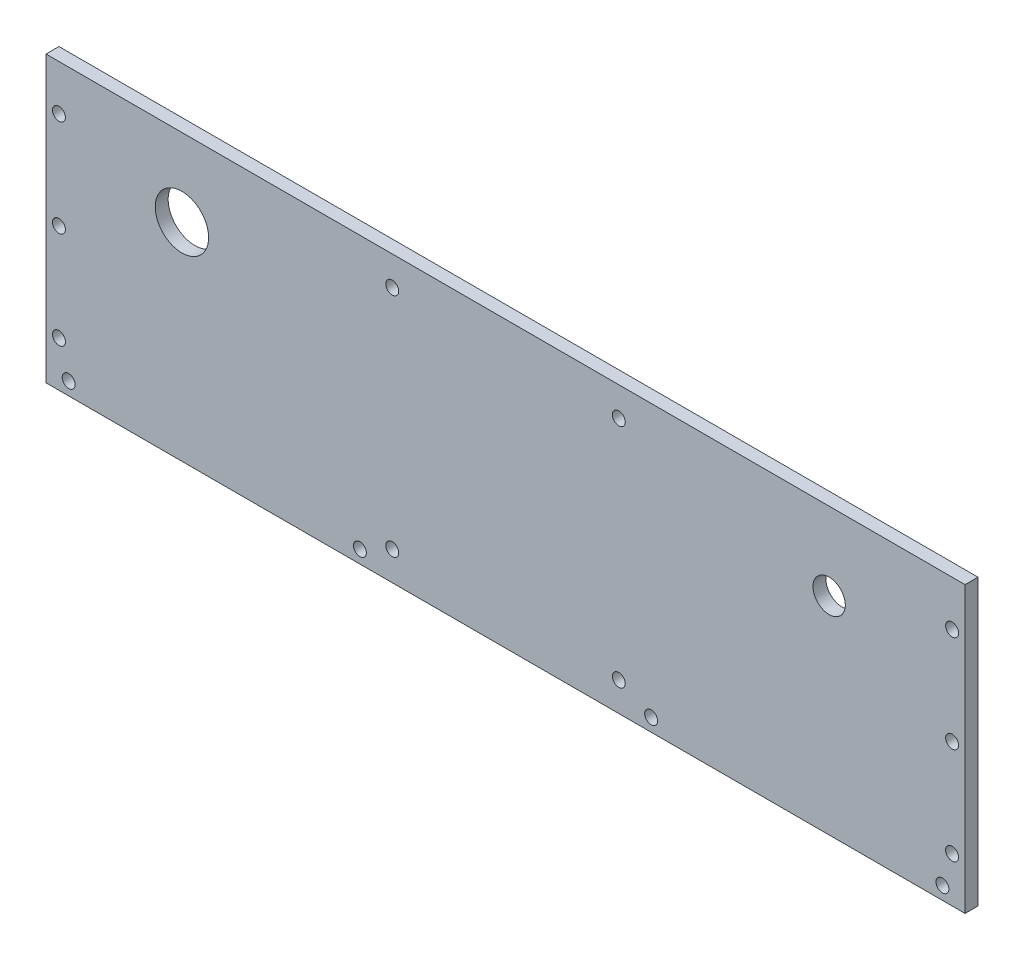
ISO-10303-21;
HEADER;
FILE_DESCRIPTION(('STEP AP214'),'2;1');
FILE_NAME('part.step','',(''),(''),'','','');
FILE_SCHEMA(('AUTOMOTIVE_DESIGN { 1 0 10303 214 1 1 1 1 }'));
ENDSEC;
DATA;
#1=APPLICATION_CONTEXT('core data for automotive mechanical design processes');
#2=APPLICATION_PROTOCOL_DEFINITION('international standard','automotive_design',2000,#1);
#3=PRODUCT_CONTEXT('',#1,'mechanical');
#4=PRODUCT('Part','Part','',(#3));
#5=PRODUCT_RELATED_PRODUCT_CATEGORY('part','',(#4));
#6=PRODUCT_DEFINITION_FORMATION('','',#4);
#7=PRODUCT_DEFINITION_CONTEXT('part definition',#1,'design');
#8=PRODUCT_DEFINITION('design','',#6,#7);
#9=PRODUCT_DEFINITION_SHAPE('','',#8);
#10=(LENGTH_UNIT() NAMED_UNIT(*) SI_UNIT(.MILLI.,.METRE.));
#11=(NAMED_UNIT(*) PLANE_ANGLE_UNIT() SI_UNIT($,.RADIAN.));
#12=(NAMED_UNIT(*) SI_UNIT($,.STERADIAN.) SOLID_ANGLE_UNIT());
#13=UNCERTAINTY_MEASURE_WITH_UNIT(LENGTH_MEASURE(1.E-05),#10,'distance_accuracy_value','');
#14=(GEOMETRIC_REPRESENTATION_CONTEXT(3) GLOBAL_UNCERTAINTY_ASSIGNED_CONTEXT((#13)) GLOBAL_UNIT_ASSIGNED_CONTEXT((#10,
#11,#12)) REPRESENTATION_CONTEXT('',''));
#15=CARTESIAN_POINT('',(0.,0.,0.));
#16=DIRECTION('',(0.,0.,1.));
#17=DIRECTION('',(1.,0.,0.));
#18=AXIS2_PLACEMENT_3D('',#15,#16,#17);
#19=CARTESIAN_POINT('',(0.,0.,4.));
#20=DIRECTION('',(1.,0.,0.));
#21=DIRECTION('',(0.,0.,-1.));
#22=AXIS2_PLACEMENT_3D('',#19,#20,#21);
#23=PLANE('',#22);
#24=DIRECTION('',(0.,-1.,0.));
#25=VECTOR('',#24,1.);
#26=CARTESIAN_POINT('',(0.,0.,0.));
#27=LINE('',#26,#25);
#28=CARTESIAN_POINT('',(0.,88.,0.));
#29=VERTEX_POINT('',#28);
#30=CARTESIAN_POINT('',(0.,0.,0.));
#31=VERTEX_POINT('',#30);
#32=EDGE_CURVE('E96',#29,#31,#27,.T.);
#33=ORIENTED_EDGE('',*,*,#32,.T.);
#34=DIRECTION('',(0.,0.,-1.));
#35=VECTOR('',#34,1.);
#36=CARTESIAN_POINT('',(0.,0.,4.));
#37=LINE('',#36,#35);
#38=CARTESIAN_POINT('',(0.,0.,4.));
#39=VERTEX_POINT('',#38);
#40=EDGE_CURVE('E11',#39,#31,#37,.T.);
#41=ORIENTED_EDGE('',*,*,#40,.F.);
#42=DIRECTION('',(0.,-1.,0.));
#43=VECTOR('',#42,1.);
#44=CARTESIAN_POINT('',(0.,0.,4.));
#45=LINE('',#44,#43);
#46=CARTESIAN_POINT('',(0.,88.,4.));
#47=VERTEX_POINT('',#46);
#48=EDGE_CURVE('E84',#47,#39,#45,.T.);
#49=ORIENTED_EDGE('',*,*,#48,.F.);
#50=DIRECTION('',(0.,0.,-1.));
#51=VECTOR('',#50,1.);
#52=CARTESIAN_POINT('',(0.,88.,4.));
#53=LINE('',#52,#51);
#54=EDGE_CURVE('E92',#47,#29,#53,.T.);
#55=ORIENTED_EDGE('',*,*,#54,.T.);
#56=EDGE_LOOP('',(#33,#41,#49,#55));
#57=FACE_BOUND('',#56,.T.);
#58=ADVANCED_FACE('F33',(#57),#23,.F.);
#59=CARTESIAN_POINT('',(0.,0.,4.));
#60=DIRECTION('',(0.,1.,0.));
#61=DIRECTION('',(0.,0.,1.));
#62=AXIS2_PLACEMENT_3D('',#59,#60,#61);
#63=PLANE('',#62);
#64=DIRECTION('',(1.,0.,0.));
#65=VECTOR('',#64,1.);
#66=CARTESIAN_POINT('',(0.,0.,0.));
#67=LINE('',#66,#65);
#68=CARTESIAN_POINT('',(284.,0.,0.));
#69=VERTEX_POINT('',#68);
#70=EDGE_CURVE('E88',#31,#69,#67,.T.);
#71=ORIENTED_EDGE('',*,*,#70,.T.);
#72=DIRECTION('',(0.,0.,-1.));
#73=VECTOR('',#72,1.);
#74=CARTESIAN_POINT('',(284.,0.,4.));
#75=LINE('',#74,#73);
#76=CARTESIAN_POINT('',(284.,0.,4.));
#77=VERTEX_POINT('',#76);
#78=EDGE_CURVE('E41',#77,#69,#75,.T.);
#79=ORIENTED_EDGE('',*,*,#78,.F.);
#80=DIRECTION('',(1.,0.,0.));
#81=VECTOR('',#80,1.);
#82=CARTESIAN_POINT('',(0.,0.,4.));
#83=LINE('',#82,#81);
#84=EDGE_CURVE('E79',#39,#77,#83,.T.);
#85=ORIENTED_EDGE('',*,*,#84,.F.);
#86=ORIENTED_EDGE('',*,*,#40,.T.);
#87=EDGE_LOOP('',(#71,#79,#85,#86));
#88=FACE_BOUND('',#87,.T.);
#89=ADVANCED_FACE('F87',(#88),#63,.F.);
#90=CARTESIAN_POINT('',(284.,0.,4.));
#91=DIRECTION('',(-1.,0.,0.));
#92=DIRECTION('',(0.,0.,1.));
#93=AXIS2_PLACEMENT_3D('',#90,#91,#92);
#94=PLANE('',#93);
#95=DIRECTION('',(0.,1.,0.));
#96=VECTOR('',#95,1.);
#97=CARTESIAN_POINT('',(284.,0.,0.));
#98=LINE('',#97,#96);
#99=CARTESIAN_POINT('',(284.,88.,0.));
#100=VERTEX_POINT('',#99);
#101=EDGE_CURVE('E66',#69,#100,#98,.T.);
#102=ORIENTED_EDGE('',*,*,#101,.T.);
#103=DIRECTION('',(0.,0.,-1.));
#104=VECTOR('',#103,1.);
#105=CARTESIAN_POINT('',(284.,88.,4.));
#106=LINE('',#105,#104);
#107=CARTESIAN_POINT('',(284.,88.,4.));
#108=VERTEX_POINT('',#107);
#109=EDGE_CURVE('E89',#108,#100,#106,.T.);
#110=ORIENTED_EDGE('',*,*,#109,.F.);
#111=DIRECTION('',(0.,1.,0.));
#112=VECTOR('',#111,1.);
#113=CARTESIAN_POINT('',(284.,0.,4.));
#114=LINE('',#113,#112);
#115=EDGE_CURVE('E82',#77,#108,#114,.T.);
#116=ORIENTED_EDGE('',*,*,#115,.F.);
#117=ORIENTED_EDGE('',*,*,#78,.T.);
#118=EDGE_LOOP('',(#102,#110,#116,#117));
#119=FACE_BOUND('',#118,.T.);
#120=ADVANCED_FACE('F90',(#119),#94,.F.);
#121=CARTESIAN_POINT('',(0.,88.,4.));
#122=DIRECTION('',(0.,-1.,0.));
#123=DIRECTION('',(0.,0.,-1.));
#124=AXIS2_PLACEMENT_3D('',#121,#122,#123);
#125=PLANE('',#124);
#126=DIRECTION('',(-1.,0.,0.));
#127=VECTOR('',#126,1.);
#128=CARTESIAN_POINT('',(0.,88.,0.));
#129=LINE('',#128,#127);
#130=EDGE_CURVE('E72',#100,#29,#129,.T.);
#131=ORIENTED_EDGE('',*,*,#130,.T.);
#132=ORIENTED_EDGE('',*,*,#54,.F.);
#133=DIRECTION('',(-1.,0.,0.));
#134=VECTOR('',#133,1.);
#135=CARTESIAN_POINT('',(0.,88.,4.));
#136=LINE('',#135,#134);
#137=EDGE_CURVE('E49',#108,#47,#136,.T.);
#138=ORIENTED_EDGE('',*,*,#137,.F.);
#139=ORIENTED_EDGE('',*,*,#109,.T.);
#140=EDGE_LOOP('',(#131,#132,#138,#139));
#141=FACE_BOUND('',#140,.T.);
#142=ADVANCED_FACE('F104',(#141),#125,.F.);
#143=CARTESIAN_POINT('',(0.,0.,4.));
#144=DIRECTION('',(0.,0.,-1.));
#145=DIRECTION('',(-1.,0.,0.));
#146=AXIS2_PLACEMENT_3D('',#143,#144,#145);
#147=PLANE('',#146);
#148=CARTESIAN_POINT('',(280.,44.,4.));
#149=DIRECTION('',(0.,0.,1.));
#150=DIRECTION('',(-1.,0.,0.));
#151=AXIS2_PLACEMENT_3D('',#148,#149,#150);
#152=CIRCLE('',#151,2.);
#153=CARTESIAN_POINT('',(278.,44.,4.));
#154=VERTEX_POINT('',#153);
#155=EDGE_CURVE('E177',#154,#154,#152,.T.);
#156=ORIENTED_EDGE('',*,*,#155,.F.);
#157=EDGE_LOOP('',(#156));
#158=FACE_BOUND('',#157,.T.);
#159=CARTESIAN_POINT('',(280.,74.,4.));
#160=DIRECTION('',(0.,0.,1.));
#161=DIRECTION('',(1.,0.,0.));
#162=AXIS2_PLACEMENT_3D('',#159,#160,#161);
#163=CIRCLE('',#162,2.);
#164=CARTESIAN_POINT('',(282.,74.,4.));
#165=VERTEX_POINT('',#164);
#166=EDGE_CURVE('E171',#165,#165,#163,.T.);
#167=ORIENTED_EDGE('',*,*,#166,.F.);
#168=EDGE_LOOP('',(#167));
#169=FACE_BOUND('',#168,.T.);
#170=CARTESIAN_POINT('',(280.,14.,4.));
#171=DIRECTION('',(0.,0.,1.));
#172=DIRECTION('',(-1.,0.,0.));
#173=AXIS2_PLACEMENT_3D('',#170,#171,#172);
#174=CIRCLE('',#173,2.);
#175=CARTESIAN_POINT('',(278.,14.,4.));
#176=VERTEX_POINT('',#175);
#177=EDGE_CURVE('E165',#176,#176,#174,.T.);
#178=ORIENTED_EDGE('',*,*,#177,.F.);
#179=EDGE_LOOP('',(#178));
#180=FACE_BOUND('',#179,.T.);
#181=CARTESIAN_POINT('',(6.99999999999999,4.00000000000002,4.));
#182=DIRECTION('',(0.,0.,1.));
#183=DIRECTION('',(1.,0.,0.));
#184=AXIS2_PLACEMENT_3D('',#181,#182,#183);
#185=CIRCLE('',#184,2.);
#186=CARTESIAN_POINT('',(9.,4.00000000000002,4.));
#187=VERTEX_POINT('',#186);
#188=EDGE_CURVE('E158',#187,#187,#185,.T.);
#189=ORIENTED_EDGE('',*,*,#188,.F.);
#190=EDGE_LOOP('',(#189));
#191=FACE_BOUND('',#190,.T.);
#192=CARTESIAN_POINT('',(97.,4.00000000000003,4.));
#193=DIRECTION('',(0.,0.,1.));
#194=DIRECTION('',(1.,0.,0.));
#195=AXIS2_PLACEMENT_3D('',#192,#193,#194);
#196=CIRCLE('',#195,2.);
#197=CARTESIAN_POINT('',(99.,4.00000000000003,4.));
#198=VERTEX_POINT('',#197);
#199=EDGE_CURVE('E200',#198,#198,#196,.T.);
#200=ORIENTED_EDGE('',*,*,#199,.F.);
#201=EDGE_LOOP('',(#200));
#202=FACE_BOUND('',#201,.T.);
#203=CARTESIAN_POINT('',(187.,4.00000000000003,4.));
#204=DIRECTION('',(0.,0.,1.));
#205=DIRECTION('',(-1.,0.,0.));
#206=AXIS2_PLACEMENT_3D('',#203,#204,#205);
#207=CIRCLE('',#206,2.);
#208=CARTESIAN_POINT('',(185.,4.00000000000003,4.));
#209=VERTEX_POINT('',#208);
#210=EDGE_CURVE('E194',#209,#209,#207,.T.);
#211=ORIENTED_EDGE('',*,*,#210,.F.);
#212=EDGE_LOOP('',(#211));
#213=FACE_BOUND('',#212,.T.);
#214=CARTESIAN_POINT('',(277.,4.00000000000002,4.));
#215=DIRECTION('',(0.,0.,1.));
#216=DIRECTION('',(-1.,0.,0.));
#217=AXIS2_PLACEMENT_3D('',#214,#215,#216);
#218=CIRCLE('',#217,2.);
#219=CARTESIAN_POINT('',(275.,4.00000000000002,4.));
#220=VERTEX_POINT('',#219);
#221=EDGE_CURVE('E188',#220,#220,#218,.T.);
#222=ORIENTED_EDGE('',*,*,#221,.F.);
#223=EDGE_LOOP('',(#222));
#224=FACE_BOUND('',#223,.T.);
#225=CARTESIAN_POINT('',(242.,64.,4.));
#226=DIRECTION('',(0.,0.,1.));
#227=DIRECTION('',(1.,0.,0.));
#228=AXIS2_PLACEMENT_3D('',#225,#226,#227);
#229=CIRCLE('',#228,4.99999999999999);
#230=CARTESIAN_POINT('',(247.,64.,4.));
#231=VERTEX_POINT('',#230);
#232=EDGE_CURVE('E182',#231,#231,#229,.T.);
#233=ORIENTED_EDGE('',*,*,#232,.F.);
#234=EDGE_LOOP('',(#233));
#235=FACE_BOUND('',#234,.T.);
#236=CARTESIAN_POINT('',(42.,64.,4.));
#237=DIRECTION('',(0.,0.,1.));
#238=DIRECTION('',(1.,0.,0.));
#239=AXIS2_PLACEMENT_3D('',#236,#237,#238);
#240=CIRCLE('',#239,8.25);
#241=CARTESIAN_POINT('',(50.25,64.,4.));
#242=VERTEX_POINT('',#241);
#243=EDGE_CURVE('E123',#242,#242,#240,.T.);
#244=ORIENTED_EDGE('',*,*,#243,.F.);
#245=EDGE_LOOP('',(#244));
#246=FACE_BOUND('',#245,.T.);
#247=CARTESIAN_POINT('',(4.,14.,4.));
#248=DIRECTION('',(0.,0.,1.));
#249=DIRECTION('',(1.,0.,0.));
#250=AXIS2_PLACEMENT_3D('',#247,#248,#249);
#251=CIRCLE('',#250,2.);
#252=CARTESIAN_POINT('',(6.,14.,4.));
#253=VERTEX_POINT('',#252);
#254=EDGE_CURVE('E116',#253,#253,#251,.T.);
#255=ORIENTED_EDGE('',*,*,#254,.F.);
#256=EDGE_LOOP('',(#255));
#257=FACE_BOUND('',#256,.T.);
#258=CARTESIAN_POINT('',(4.,74.,4.));
#259=DIRECTION('',(0.,0.,1.));
#260=DIRECTION('',(-1.,0.,0.));
#261=AXIS2_PLACEMENT_3D('',#258,#259,#260);
#262=CIRCLE('',#261,2.);
#263=CARTESIAN_POINT('',(1.99999999999999,74.,4.));
#264=VERTEX_POINT('',#263);
#265=EDGE_CURVE('E137',#264,#264,#262,.T.);
#266=ORIENTED_EDGE('',*,*,#265,.F.);
#267=EDGE_LOOP('',(#266));
#268=FACE_BOUND('',#267,.T.);
#269=CARTESIAN_POINT('',(4.00000000000001,44.,4.));
#270=DIRECTION('',(0.,0.,1.));
#271=DIRECTION('',(1.,0.,0.));
#272=AXIS2_PLACEMENT_3D('',#269,#270,#271);
#273=CIRCLE('',#272,2.);
#274=CARTESIAN_POINT('',(6.00000000000001,44.,4.));
#275=VERTEX_POINT('',#274);
#276=EDGE_CURVE('E130',#275,#275,#273,.T.);
#277=ORIENTED_EDGE('',*,*,#276,.F.);
#278=EDGE_LOOP('',(#277));
#279=FACE_BOUND('',#278,.T.);
#280=CARTESIAN_POINT('',(177.,79.,4.));
#281=DIRECTION('',(0.,0.,1.));
#282=DIRECTION('',(-1.,0.,0.));
#283=AXIS2_PLACEMENT_3D('',#280,#281,#282);
#284=CIRCLE('',#283,2.);
#285=CARTESIAN_POINT('',(175.,79.,4.));
#286=VERTEX_POINT('',#285);
#287=EDGE_CURVE('E129',#286,#286,#284,.T.);
#288=ORIENTED_EDGE('',*,*,#287,.F.);
#289=EDGE_LOOP('',(#288));
#290=FACE_BOUND('',#289,.T.);
#291=CARTESIAN_POINT('',(177.,9.00000000000001,4.));
#292=DIRECTION('',(0.,0.,1.));
#293=DIRECTION('',(1.,0.,0.));
#294=AXIS2_PLACEMENT_3D('',#291,#292,#293);
#295=CIRCLE('',#294,2.);
#296=CARTESIAN_POINT('',(179.,9.00000000000001,4.));
#297=VERTEX_POINT('',#296);
#298=EDGE_CURVE('E147',#297,#297,#295,.T.);
#299=ORIENTED_EDGE('',*,*,#298,.F.);
#300=EDGE_LOOP('',(#299));
#301=FACE_BOUND('',#300,.T.);
#302=CARTESIAN_POINT('',(107.,9.00000000000001,4.));
#303=DIRECTION('',(0.,0.,1.));
#304=DIRECTION('',(-1.,0.,0.));
#305=AXIS2_PLACEMENT_3D('',#302,#303,#304);
#306=CIRCLE('',#305,2.);
#307=CARTESIAN_POINT('',(105.,9.00000000000001,4.));
#308=VERTEX_POINT('',#307);
#309=EDGE_CURVE('E153',#308,#308,#306,.T.);
#310=ORIENTED_EDGE('',*,*,#309,.F.);
#311=EDGE_LOOP('',(#310));
#312=FACE_BOUND('',#311,.T.);
#313=CARTESIAN_POINT('',(107.,79.,4.));
#314=DIRECTION('',(0.,0.,1.));
#315=DIRECTION('',(1.,0.,0.));
#316=AXIS2_PLACEMENT_3D('',#313,#314,#315);
#317=CIRCLE('',#316,2.);
#318=CARTESIAN_POINT('',(109.,79.,4.));
#319=VERTEX_POINT('',#318);
#320=EDGE_CURVE('E110',#319,#319,#317,.T.);
#321=ORIENTED_EDGE('',*,*,#320,.F.);
#322=EDGE_LOOP('',(#321));
#323=FACE_BOUND('',#322,.T.);
#324=ORIENTED_EDGE('',*,*,#48,.T.);
#325=ORIENTED_EDGE('',*,*,#84,.T.);
#326=ORIENTED_EDGE('',*,*,#115,.T.);
#327=ORIENTED_EDGE('',*,*,#137,.T.);
#328=EDGE_LOOP('',(#324,#325,#326,#327));
#329=FACE_BOUND('',#328,.T.);
#330=ADVANCED_FACE('F80',(#158,#169,#180,#191,#202,#213,#224,#235,#246,#257,#268,#279,#290,#301,
#312,#323,#329),#147,.F.);
#331=CARTESIAN_POINT('',(0.,0.,0.));
#332=DIRECTION('',(0.,0.,-1.));
#333=DIRECTION('',(-1.,0.,0.));
#334=AXIS2_PLACEMENT_3D('',#331,#332,#333);
#335=PLANE('',#334);
#336=CARTESIAN_POINT('',(280.,44.,0.));
#337=DIRECTION('',(0.,0.,1.));
#338=DIRECTION('',(-1.,0.,0.));
#339=AXIS2_PLACEMENT_3D('',#336,#337,#338);
#340=CIRCLE('',#339,2.);
#341=CARTESIAN_POINT('',(278.,44.,0.));
#342=VERTEX_POINT('',#341);
#343=EDGE_CURVE('E134',#342,#342,#340,.T.);
#344=ORIENTED_EDGE('',*,*,#343,.T.);
#345=EDGE_LOOP('',(#344));
#346=FACE_BOUND('',#345,.T.);
#347=CARTESIAN_POINT('',(280.,74.,0.));
#348=DIRECTION('',(0.,0.,1.));
#349=DIRECTION('',(1.,0.,0.));
#350=AXIS2_PLACEMENT_3D('',#347,#348,#349);
#351=CIRCLE('',#350,2.);
#352=CARTESIAN_POINT('',(282.,74.,0.));
#353=VERTEX_POINT('',#352);
#354=EDGE_CURVE('E174',#353,#353,#351,.T.);
#355=ORIENTED_EDGE('',*,*,#354,.T.);
#356=EDGE_LOOP('',(#355));
#357=FACE_BOUND('',#356,.T.);
#358=CARTESIAN_POINT('',(280.,14.,0.));
#359=DIRECTION('',(0.,0.,1.));
#360=DIRECTION('',(-1.,0.,0.));
#361=AXIS2_PLACEMENT_3D('',#358,#359,#360);
#362=CIRCLE('',#361,2.);
#363=CARTESIAN_POINT('',(278.,14.,0.));
#364=VERTEX_POINT('',#363);
#365=EDGE_CURVE('E168',#364,#364,#362,.T.);
#366=ORIENTED_EDGE('',*,*,#365,.T.);
#367=EDGE_LOOP('',(#366));
#368=FACE_BOUND('',#367,.T.);
#369=CARTESIAN_POINT('',(6.99999999999999,4.00000000000002,0.));
#370=DIRECTION('',(0.,0.,1.));
#371=DIRECTION('',(1.,0.,0.));
#372=AXIS2_PLACEMENT_3D('',#369,#370,#371);
#373=CIRCLE('',#372,2.);
#374=CARTESIAN_POINT('',(9.,4.00000000000002,0.));
#375=VERTEX_POINT('',#374);
#376=EDGE_CURVE('E161',#375,#375,#373,.T.);
#377=ORIENTED_EDGE('',*,*,#376,.T.);
#378=EDGE_LOOP('',(#377));
#379=FACE_BOUND('',#378,.T.);
#380=CARTESIAN_POINT('',(97.,4.00000000000003,0.));
#381=DIRECTION('',(0.,0.,1.));
#382=DIRECTION('',(1.,0.,0.));
#383=AXIS2_PLACEMENT_3D('',#380,#381,#382);
#384=CIRCLE('',#383,2.);
#385=CARTESIAN_POINT('',(99.,4.00000000000003,0.));
#386=VERTEX_POINT('',#385);
#387=EDGE_CURVE('E162',#386,#386,#384,.T.);
#388=ORIENTED_EDGE('',*,*,#387,.T.);
#389=EDGE_LOOP('',(#388));
#390=FACE_BOUND('',#389,.T.);
#391=CARTESIAN_POINT('',(187.,4.00000000000003,0.));
#392=DIRECTION('',(0.,0.,1.));
#393=DIRECTION('',(-1.,0.,0.));
#394=AXIS2_PLACEMENT_3D('',#391,#392,#393);
#395=CIRCLE('',#394,2.);
#396=CARTESIAN_POINT('',(185.,4.00000000000003,0.));
#397=VERTEX_POINT('',#396);
#398=EDGE_CURVE('E197',#397,#397,#395,.T.);
#399=ORIENTED_EDGE('',*,*,#398,.T.);
#400=EDGE_LOOP('',(#399));
#401=FACE_BOUND('',#400,.T.);
#402=CARTESIAN_POINT('',(277.,4.00000000000002,0.));
#403=DIRECTION('',(0.,0.,1.));
#404=DIRECTION('',(-1.,0.,0.));
#405=AXIS2_PLACEMENT_3D('',#402,#403,#404);
#406=CIRCLE('',#405,2.);
#407=CARTESIAN_POINT('',(275.,4.00000000000002,0.));
#408=VERTEX_POINT('',#407);
#409=EDGE_CURVE('E191',#408,#408,#406,.T.);
#410=ORIENTED_EDGE('',*,*,#409,.T.);
#411=EDGE_LOOP('',(#410));
#412=FACE_BOUND('',#411,.T.);
#413=CARTESIAN_POINT('',(242.,64.,0.));
#414=DIRECTION('',(0.,0.,1.));
#415=DIRECTION('',(1.,0.,0.));
#416=AXIS2_PLACEMENT_3D('',#413,#414,#415);
#417=CIRCLE('',#416,4.99999999999999);
#418=CARTESIAN_POINT('',(247.,64.,0.));
#419=VERTEX_POINT('',#418);
#420=EDGE_CURVE('E185',#419,#419,#417,.T.);
#421=ORIENTED_EDGE('',*,*,#420,.T.);
#422=EDGE_LOOP('',(#421));
#423=FACE_BOUND('',#422,.T.);
#424=CARTESIAN_POINT('',(42.,64.,0.));
#425=DIRECTION('',(0.,0.,1.));
#426=DIRECTION('',(1.,0.,0.));
#427=AXIS2_PLACEMENT_3D('',#424,#425,#426);
#428=CIRCLE('',#427,8.25);
#429=CARTESIAN_POINT('',(50.25,64.,0.));
#430=VERTEX_POINT('',#429);
#431=EDGE_CURVE('E126',#430,#430,#428,.T.);
#432=ORIENTED_EDGE('',*,*,#431,.T.);
#433=EDGE_LOOP('',(#432));
#434=FACE_BOUND('',#433,.T.);
#435=CARTESIAN_POINT('',(4.,14.,0.));
#436=DIRECTION('',(0.,0.,1.));
#437=DIRECTION('',(1.,0.,0.));
#438=AXIS2_PLACEMENT_3D('',#435,#436,#437);
#439=CIRCLE('',#438,2.);
#440=CARTESIAN_POINT('',(6.,14.,0.));
#441=VERTEX_POINT('',#440);
#442=EDGE_CURVE('E119',#441,#441,#439,.T.);
#443=ORIENTED_EDGE('',*,*,#442,.T.);
#444=EDGE_LOOP('',(#443));
#445=FACE_BOUND('',#444,.T.);
#446=CARTESIAN_POINT('',(4.,74.,0.));
#447=DIRECTION('',(0.,0.,1.));
#448=DIRECTION('',(-1.,0.,0.));
#449=AXIS2_PLACEMENT_3D('',#446,#447,#448);
#450=CIRCLE('',#449,2.);
#451=CARTESIAN_POINT('',(1.99999999999999,74.,0.));
#452=VERTEX_POINT('',#451);
#453=EDGE_CURVE('E120',#452,#452,#450,.T.);
#454=ORIENTED_EDGE('',*,*,#453,.T.);
#455=EDGE_LOOP('',(#454));
#456=FACE_BOUND('',#455,.T.);
#457=CARTESIAN_POINT('',(4.00000000000001,44.,0.));
#458=DIRECTION('',(0.,0.,1.));
#459=DIRECTION('',(1.,0.,0.));
#460=AXIS2_PLACEMENT_3D('',#457,#458,#459);
#461=CIRCLE('',#460,2.);
#462=CARTESIAN_POINT('',(6.00000000000001,44.,0.));
#463=VERTEX_POINT('',#462);
#464=EDGE_CURVE('E133',#463,#463,#461,.T.);
#465=ORIENTED_EDGE('',*,*,#464,.T.);
#466=EDGE_LOOP('',(#465));
#467=FACE_BOUND('',#466,.T.);
#468=CARTESIAN_POINT('',(177.,79.,0.));
#469=DIRECTION('',(0.,0.,1.));
#470=DIRECTION('',(-1.,0.,0.));
#471=AXIS2_PLACEMENT_3D('',#468,#469,#470);
#472=CIRCLE('',#471,2.);
#473=CARTESIAN_POINT('',(175.,79.,0.));
#474=VERTEX_POINT('',#473);
#475=EDGE_CURVE('E144',#474,#474,#472,.T.);
#476=ORIENTED_EDGE('',*,*,#475,.T.);
#477=EDGE_LOOP('',(#476));
#478=FACE_BOUND('',#477,.T.);
#479=CARTESIAN_POINT('',(177.,9.00000000000001,0.));
#480=DIRECTION('',(0.,0.,1.));
#481=DIRECTION('',(1.,0.,0.));
#482=AXIS2_PLACEMENT_3D('',#479,#480,#481);
#483=CIRCLE('',#482,2.);
#484=CARTESIAN_POINT('',(179.,9.00000000000001,0.));
#485=VERTEX_POINT('',#484);
#486=EDGE_CURVE('E150',#485,#485,#483,.T.);
#487=ORIENTED_EDGE('',*,*,#486,.T.);
#488=EDGE_LOOP('',(#487));
#489=FACE_BOUND('',#488,.T.);
#490=CARTESIAN_POINT('',(107.,9.00000000000001,0.));
#491=DIRECTION('',(0.,0.,1.));
#492=DIRECTION('',(-1.,0.,0.));
#493=AXIS2_PLACEMENT_3D('',#490,#491,#492);
#494=CIRCLE('',#493,2.);
#495=CARTESIAN_POINT('',(105.,9.00000000000001,0.));
#496=VERTEX_POINT('',#495);
#497=EDGE_CURVE('E113',#496,#496,#494,.T.);
#498=ORIENTED_EDGE('',*,*,#497,.T.);
#499=EDGE_LOOP('',(#498));
#500=FACE_BOUND('',#499,.T.);
#501=CARTESIAN_POINT('',(107.,79.,0.));
#502=DIRECTION('',(0.,0.,1.));
#503=DIRECTION('',(1.,0.,0.));
#504=AXIS2_PLACEMENT_3D('',#501,#502,#503);
#505=CIRCLE('',#504,2.);
#506=CARTESIAN_POINT('',(109.,79.,0.));
#507=VERTEX_POINT('',#506);
#508=EDGE_CURVE('E99',#507,#507,#505,.T.);
#509=ORIENTED_EDGE('',*,*,#508,.T.);
#510=EDGE_LOOP('',(#509));
#511=FACE_BOUND('',#510,.T.);
#512=ORIENTED_EDGE('',*,*,#32,.F.);
#513=ORIENTED_EDGE('',*,*,#130,.F.);
#514=ORIENTED_EDGE('',*,*,#101,.F.);
#515=ORIENTED_EDGE('',*,*,#70,.F.);
#516=EDGE_LOOP('',(#512,#513,#514,#515));
#517=FACE_BOUND('',#516,.T.);
#518=ADVANCED_FACE('F107',(#346,#357,#368,#379,#390,#401,#412,#423,#434,#445,#456,#467,#478,
#489,#500,#511,#517),#335,.T.);
#519=CARTESIAN_POINT('',(107.,79.,0.));
#520=DIRECTION('',(0.,0.,1.));
#521=DIRECTION('',(1.,0.,0.));
#522=AXIS2_PLACEMENT_3D('',#519,#520,#521);
#523=CYLINDRICAL_SURFACE('',#522,2.);
#524=ORIENTED_EDGE('',*,*,#508,.F.);
#525=EDGE_LOOP('',(#524));
#526=FACE_BOUND('',#525,.T.);
#527=ORIENTED_EDGE('',*,*,#320,.T.);
#528=EDGE_LOOP('',(#527));
#529=FACE_BOUND('',#528,.T.);
#530=ADVANCED_FACE('F242',(#526,#529),#523,.F.);
#531=CARTESIAN_POINT('',(107.,9.00000000000001,0.));
#532=DIRECTION('',(0.,0.,1.));
#533=DIRECTION('',(1.,0.,0.));
#534=AXIS2_PLACEMENT_3D('',#531,#532,#533);
#535=CYLINDRICAL_SURFACE('',#534,2.);
#536=ORIENTED_EDGE('',*,*,#497,.F.);
#537=EDGE_LOOP('',(#536));
#538=FACE_BOUND('',#537,.T.);
#539=ORIENTED_EDGE('',*,*,#309,.T.);
#540=EDGE_LOOP('',(#539));
#541=FACE_BOUND('',#540,.T.);
#542=ADVANCED_FACE('F244',(#538,#541),#535,.F.);
#543=CARTESIAN_POINT('',(177.,9.00000000000001,0.));
#544=DIRECTION('',(0.,0.,1.));
#545=DIRECTION('',(1.,0.,0.));
#546=AXIS2_PLACEMENT_3D('',#543,#544,#545);
#547=CYLINDRICAL_SURFACE('',#546,2.);
#548=ORIENTED_EDGE('',*,*,#486,.F.);
#549=EDGE_LOOP('',(#548));
#550=FACE_BOUND('',#549,.T.);
#551=ORIENTED_EDGE('',*,*,#298,.T.);
#552=EDGE_LOOP('',(#551));
#553=FACE_BOUND('',#552,.T.);
#554=ADVANCED_FACE('F251',(#550,#553),#547,.F.);
#555=CARTESIAN_POINT('',(177.,79.,0.));
#556=DIRECTION('',(0.,0.,1.));
#557=DIRECTION('',(1.,0.,0.));
#558=AXIS2_PLACEMENT_3D('',#555,#556,#557);
#559=CYLINDRICAL_SURFACE('',#558,2.);
#560=ORIENTED_EDGE('',*,*,#475,.F.);
#561=EDGE_LOOP('',(#560));
#562=FACE_BOUND('',#561,.T.);
#563=ORIENTED_EDGE('',*,*,#287,.T.);
#564=EDGE_LOOP('',(#563));
#565=FACE_BOUND('',#564,.T.);
#566=ADVANCED_FACE('F301',(#562,#565),#559,.F.);
#567=CARTESIAN_POINT('',(4.00000000000001,44.,0.));
#568=DIRECTION('',(0.,0.,1.));
#569=DIRECTION('',(1.,0.,0.));
#570=AXIS2_PLACEMENT_3D('',#567,#568,#569);
#571=CYLINDRICAL_SURFACE('',#570,2.);
#572=ORIENTED_EDGE('',*,*,#464,.F.);
#573=EDGE_LOOP('',(#572));
#574=FACE_BOUND('',#573,.T.);
#575=ORIENTED_EDGE('',*,*,#276,.T.);
#576=EDGE_LOOP('',(#575));
#577=FACE_BOUND('',#576,.T.);
#578=ADVANCED_FACE('F311',(#574,#577),#571,.F.);
#579=CARTESIAN_POINT('',(4.,74.,0.));
#580=DIRECTION('',(0.,0.,1.));
#581=DIRECTION('',(1.,0.,0.));
#582=AXIS2_PLACEMENT_3D('',#579,#580,#581);
#583=CYLINDRICAL_SURFACE('',#582,2.);
#584=ORIENTED_EDGE('',*,*,#453,.F.);
#585=EDGE_LOOP('',(#584));
#586=FACE_BOUND('',#585,.T.);
#587=ORIENTED_EDGE('',*,*,#265,.T.);
#588=EDGE_LOOP('',(#587));
#589=FACE_BOUND('',#588,.T.);
#590=ADVANCED_FACE('F321',(#586,#589),#583,.F.);
#591=CARTESIAN_POINT('',(4.,14.,0.));
#592=DIRECTION('',(0.,0.,1.));
#593=DIRECTION('',(1.,0.,0.));
#594=AXIS2_PLACEMENT_3D('',#591,#592,#593);
#595=CYLINDRICAL_SURFACE('',#594,2.);
#596=ORIENTED_EDGE('',*,*,#442,.F.);
#597=EDGE_LOOP('',(#596));
#598=FACE_BOUND('',#597,.T.);
#599=ORIENTED_EDGE('',*,*,#254,.T.);
#600=EDGE_LOOP('',(#599));
#601=FACE_BOUND('',#600,.T.);
#602=ADVANCED_FACE('F331',(#598,#601),#595,.F.);
#603=CARTESIAN_POINT('',(42.,64.,0.));
#604=DIRECTION('',(0.,0.,1.));
#605=DIRECTION('',(1.,0.,0.));
#606=AXIS2_PLACEMENT_3D('',#603,#604,#605);
#607=CYLINDRICAL_SURFACE('',#606,8.25);
#608=ORIENTED_EDGE('',*,*,#431,.F.);
#609=EDGE_LOOP('',(#608));
#610=FACE_BOUND('',#609,.T.);
#611=ORIENTED_EDGE('',*,*,#243,.T.);
#612=EDGE_LOOP('',(#611));
#613=FACE_BOUND('',#612,.T.);
#614=ADVANCED_FACE('F341',(#610,#613),#607,.F.);
#615=CARTESIAN_POINT('',(242.,64.,0.));
#616=DIRECTION('',(0.,0.,1.));
#617=DIRECTION('',(1.,0.,0.));
#618=AXIS2_PLACEMENT_3D('',#615,#616,#617);
#619=CYLINDRICAL_SURFACE('',#618,4.99999999999999);
#620=ORIENTED_EDGE('',*,*,#420,.F.);
#621=EDGE_LOOP('',(#620));
#622=FACE_BOUND('',#621,.T.);
#623=ORIENTED_EDGE('',*,*,#232,.T.);
#624=EDGE_LOOP('',(#623));
#625=FACE_BOUND('',#624,.T.);
#626=ADVANCED_FACE('F350',(#622,#625),#619,.F.);
#627=CARTESIAN_POINT('',(277.,4.00000000000002,0.));
#628=DIRECTION('',(0.,0.,1.));
#629=DIRECTION('',(1.,0.,0.));
#630=AXIS2_PLACEMENT_3D('',#627,#628,#629);
#631=CYLINDRICAL_SURFACE('',#630,2.);
#632=ORIENTED_EDGE('',*,*,#409,.F.);
#633=EDGE_LOOP('',(#632));
#634=FACE_BOUND('',#633,.T.);
#635=ORIENTED_EDGE('',*,*,#221,.T.);
#636=EDGE_LOOP('',(#635));
#637=FACE_BOUND('',#636,.T.);
#638=ADVANCED_FACE('F360',(#634,#637),#631,.F.);
#639=CARTESIAN_POINT('',(187.,4.00000000000003,0.));
#640=DIRECTION('',(0.,0.,1.));
#641=DIRECTION('',(1.,0.,0.));
#642=AXIS2_PLACEMENT_3D('',#639,#640,#641);
#643=CYLINDRICAL_SURFACE('',#642,2.);
#644=ORIENTED_EDGE('',*,*,#398,.F.);
#645=EDGE_LOOP('',(#644));
#646=FACE_BOUND('',#645,.T.);
#647=ORIENTED_EDGE('',*,*,#210,.T.);
#648=EDGE_LOOP('',(#647));
#649=FACE_BOUND('',#648,.T.);
#650=ADVANCED_FACE('F212',(#646,#649),#643,.F.);
#651=CARTESIAN_POINT('',(97.,4.00000000000003,0.));
#652=DIRECTION('',(0.,0.,1.));
#653=DIRECTION('',(1.,0.,0.));
#654=AXIS2_PLACEMENT_3D('',#651,#652,#653);
#655=CYLINDRICAL_SURFACE('',#654,2.);
#656=ORIENTED_EDGE('',*,*,#387,.F.);
#657=EDGE_LOOP('',(#656));
#658=FACE_BOUND('',#657,.T.);
#659=ORIENTED_EDGE('',*,*,#199,.T.);
#660=EDGE_LOOP('',(#659));
#661=FACE_BOUND('',#660,.T.);
#662=ADVANCED_FACE('F208',(#658,#661),#655,.F.);
#663=CARTESIAN_POINT('',(6.99999999999999,4.00000000000002,0.));
#664=DIRECTION('',(0.,0.,1.));
#665=DIRECTION('',(1.,0.,0.));
#666=AXIS2_PLACEMENT_3D('',#663,#664,#665);
#667=CYLINDRICAL_SURFACE('',#666,2.);
#668=ORIENTED_EDGE('',*,*,#376,.F.);
#669=EDGE_LOOP('',(#668));
#670=FACE_BOUND('',#669,.T.);
#671=ORIENTED_EDGE('',*,*,#188,.T.);
#672=EDGE_LOOP('',(#671));
#673=FACE_BOUND('',#672,.T.);
#674=ADVANCED_FACE('F211',(#670,#673),#667,.F.);
#675=CARTESIAN_POINT('',(280.,14.,0.));
#676=DIRECTION('',(0.,0.,1.));
#677=DIRECTION('',(1.,0.,0.));
#678=AXIS2_PLACEMENT_3D('',#675,#676,#677);
#679=CYLINDRICAL_SURFACE('',#678,2.);
#680=ORIENTED_EDGE('',*,*,#365,.F.);
#681=EDGE_LOOP('',(#680));
#682=FACE_BOUND('',#681,.T.);
#683=ORIENTED_EDGE('',*,*,#177,.T.);
#684=EDGE_LOOP('',(#683));
#685=FACE_BOUND('',#684,.T.);
#686=ADVANCED_FACE('F394',(#682,#685),#679,.F.);
#687=CARTESIAN_POINT('',(280.,74.,0.));
#688=DIRECTION('',(0.,0.,1.));
#689=DIRECTION('',(1.,0.,0.));
#690=AXIS2_PLACEMENT_3D('',#687,#688,#689);
#691=CYLINDRICAL_SURFACE('',#690,2.);
#692=ORIENTED_EDGE('',*,*,#354,.F.);
#693=EDGE_LOOP('',(#692));
#694=FACE_BOUND('',#693,.T.);
#695=ORIENTED_EDGE('',*,*,#166,.T.);
#696=EDGE_LOOP('',(#695));
#697=FACE_BOUND('',#696,.T.);
#698=ADVANCED_FACE('F404',(#694,#697),#691,.F.);
#699=CARTESIAN_POINT('',(280.,44.,0.));
#700=DIRECTION('',(0.,0.,1.));
#701=DIRECTION('',(1.,0.,0.));
#702=AXIS2_PLACEMENT_3D('',#699,#700,#701);
#703=CYLINDRICAL_SURFACE('',#702,2.);
#704=ORIENTED_EDGE('',*,*,#343,.F.);
#705=EDGE_LOOP('',(#704));
#706=FACE_BOUND('',#705,.T.);
#707=ORIENTED_EDGE('',*,*,#155,.T.);
#708=EDGE_LOOP('',(#707));
#709=FACE_BOUND('',#708,.T.);
#710=ADVANCED_FACE('F414',(#706,#709),#703,.F.);
#711=CLOSED_SHELL('',(#58,#89,#120,#142,#330,#518,#530,#542,#554,#566,#578,#590,#602,#614,#626,
#638,#650,#662,#674,#686,#698,#710));
#712=MANIFOLD_SOLID_BREP('B2',#711);
#713=ADVANCED_BREP_SHAPE_REPRESENTATION('',(#18,#712),#14);
#714=SHAPE_DEFINITION_REPRESENTATION(#9,#713);
ENDSEC;
END-ISO-10303-21;
